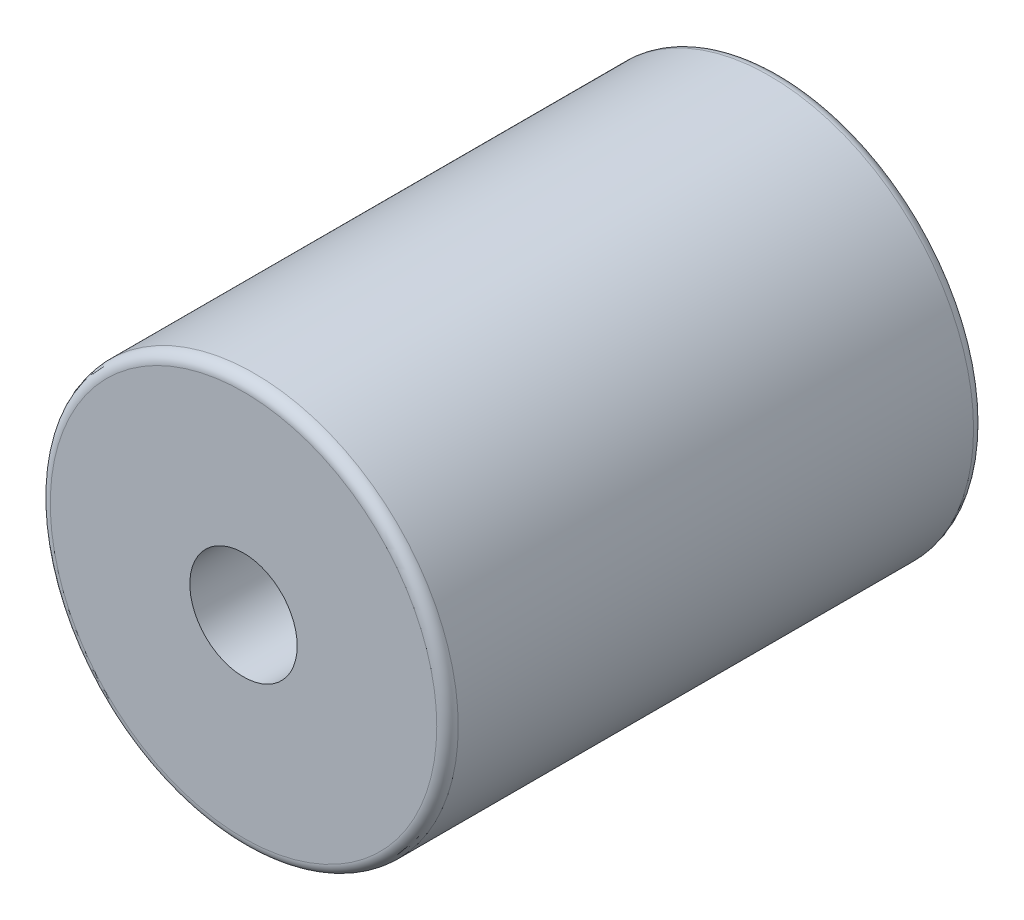
ISO-10303-21;
HEADER;
FILE_DESCRIPTION(('STEP AP214'),'2;1');
FILE_NAME('part.step','',(''),(''),'','','');
FILE_SCHEMA(('AUTOMOTIVE_DESIGN { 1 0 10303 214 1 1 1 1 }'));
ENDSEC;
DATA;
#1=APPLICATION_CONTEXT('core data for automotive mechanical design processes');
#2=APPLICATION_PROTOCOL_DEFINITION('international standard','automotive_design',2000,#1);
#3=PRODUCT_CONTEXT('',#1,'mechanical');
#4=PRODUCT('Part','Part','',(#3));
#5=PRODUCT_RELATED_PRODUCT_CATEGORY('part','',(#4));
#6=PRODUCT_DEFINITION_FORMATION('','',#4);
#7=PRODUCT_DEFINITION_CONTEXT('part definition',#1,'design');
#8=PRODUCT_DEFINITION('design','',#6,#7);
#9=PRODUCT_DEFINITION_SHAPE('','',#8);
#10=(LENGTH_UNIT() NAMED_UNIT(*) SI_UNIT(.MILLI.,.METRE.));
#11=(NAMED_UNIT(*) PLANE_ANGLE_UNIT() SI_UNIT($,.RADIAN.));
#12=(NAMED_UNIT(*) SI_UNIT($,.STERADIAN.) SOLID_ANGLE_UNIT());
#13=UNCERTAINTY_MEASURE_WITH_UNIT(LENGTH_MEASURE(1.E-05),#10,'distance_accuracy_value','');
#14=(GEOMETRIC_REPRESENTATION_CONTEXT(3) GLOBAL_UNCERTAINTY_ASSIGNED_CONTEXT((#13)) GLOBAL_UNIT_ASSIGNED_CONTEXT((#10,
#11,#12)) REPRESENTATION_CONTEXT('',''));
#15=CARTESIAN_POINT('',(0.,0.,0.));
#16=DIRECTION('',(0.,0.,1.));
#17=DIRECTION('',(1.,0.,0.));
#18=AXIS2_PLACEMENT_3D('',#15,#16,#17);
#19=CARTESIAN_POINT('',(0.,0.,4.5));
#20=DIRECTION('',(0.,0.,1.));
#21=DIRECTION('',(1.,0.,0.));
#22=AXIS2_PLACEMENT_3D('',#19,#20,#21);
#23=CYLINDRICAL_SURFACE('',#22,2.5);
#24=CARTESIAN_POINT('',(0.,0.,12.5));
#25=DIRECTION('',(0.,0.,1.));
#26=DIRECTION('',(1.,0.,0.));
#27=AXIS2_PLACEMENT_3D('',#24,#25,#26);
#28=CIRCLE('',#27,2.5);
#29=CARTESIAN_POINT('',(2.5,0.,12.5));
#30=VERTEX_POINT('',#29);
#31=EDGE_CURVE('E53',#30,#30,#28,.T.);
#32=ORIENTED_EDGE('',*,*,#31,.T.);
#33=EDGE_LOOP('',(#32));
#34=FACE_BOUND('',#33,.T.);
#35=CARTESIAN_POINT('',(0.,0.,5.5));
#36=DIRECTION('',(0.,0.,-1.));
#37=DIRECTION('',(-1.,0.,0.));
#38=AXIS2_PLACEMENT_3D('',#35,#36,#37);
#39=CIRCLE('',#38,2.5);
#40=CARTESIAN_POINT('',(-2.5,0.,5.5));
#41=VERTEX_POINT('',#40);
#42=EDGE_CURVE('E54',#41,#41,#39,.F.);
#43=ORIENTED_EDGE('',*,*,#42,.F.);
#44=EDGE_LOOP('',(#43));
#45=FACE_BOUND('',#44,.T.);
#46=ADVANCED_FACE('F33',(#34,#45),#23,.F.);
#47=CARTESIAN_POINT('',(0.,0.,-12.5));
#48=DIRECTION('',(0.,0.,1.));
#49=DIRECTION('',(1.,0.,0.));
#50=AXIS2_PLACEMENT_3D('',#47,#48,#49);
#51=CYLINDRICAL_SURFACE('',#50,9.5);
#52=CARTESIAN_POINT('',(0.,0.,12.));
#53=DIRECTION('',(0.,0.,1.));
#54=DIRECTION('',(1.,0.,0.));
#55=AXIS2_PLACEMENT_3D('',#52,#53,#54);
#56=CIRCLE('',#55,9.5);
#57=CARTESIAN_POINT('',(9.5,0.,12.));
#58=VERTEX_POINT('',#57);
#59=EDGE_CURVE('E10',#58,#58,#56,.F.);
#60=ORIENTED_EDGE('',*,*,#59,.T.);
#61=EDGE_LOOP('',(#60));
#62=FACE_BOUND('',#61,.T.);
#63=CARTESIAN_POINT('',(0.,0.,-12.));
#64=DIRECTION('',(0.,0.,1.));
#65=DIRECTION('',(1.,0.,0.));
#66=AXIS2_PLACEMENT_3D('',#63,#64,#65);
#67=CIRCLE('',#66,9.5);
#68=CARTESIAN_POINT('',(9.5,0.,-12.));
#69=VERTEX_POINT('',#68);
#70=EDGE_CURVE('E48',#69,#69,#67,.T.);
#71=ORIENTED_EDGE('',*,*,#70,.T.);
#72=EDGE_LOOP('',(#71));
#73=FACE_BOUND('',#72,.T.);
#74=ADVANCED_FACE('F79',(#62,#73),#51,.T.);
#75=CARTESIAN_POINT('',(0.,0.,-12.5));
#76=DIRECTION('',(0.,0.,1.));
#77=DIRECTION('',(1.,0.,0.));
#78=AXIS2_PLACEMENT_3D('',#75,#76,#77);
#79=PLANE('',#78);
#80=CARTESIAN_POINT('',(0.,0.,-12.5));
#81=DIRECTION('',(0.,0.,1.));
#82=DIRECTION('',(1.,0.,0.));
#83=AXIS2_PLACEMENT_3D('',#80,#81,#82);
#84=CIRCLE('',#83,9.);
#85=CARTESIAN_POINT('',(9.,0.,-12.5));
#86=VERTEX_POINT('',#85);
#87=EDGE_CURVE('E44',#86,#86,#84,.F.);
#88=ORIENTED_EDGE('',*,*,#87,.T.);
#89=EDGE_LOOP('',(#88));
#90=FACE_BOUND('',#89,.T.);
#91=CARTESIAN_POINT('',(0.,0.,-12.5));
#92=DIRECTION('',(0.,0.,-1.));
#93=DIRECTION('',(-1.,0.,0.));
#94=AXIS2_PLACEMENT_3D('',#91,#92,#93);
#95=CIRCLE('',#94,4.);
#96=CARTESIAN_POINT('',(-4.,0.,-12.5));
#97=VERTEX_POINT('',#96);
#98=EDGE_CURVE('E60',#97,#97,#95,.T.);
#99=ORIENTED_EDGE('',*,*,#98,.F.);
#100=EDGE_LOOP('',(#99));
#101=FACE_BOUND('',#100,.T.);
#102=ADVANCED_FACE('F76',(#90,#101),#79,.F.);
#103=CARTESIAN_POINT('',(0.,0.,12.5));
#104=DIRECTION('',(0.,0.,1.));
#105=DIRECTION('',(1.,0.,0.));
#106=AXIS2_PLACEMENT_3D('',#103,#104,#105);
#107=PLANE('',#106);
#108=CARTESIAN_POINT('',(0.,0.,12.5));
#109=DIRECTION('',(0.,0.,1.));
#110=DIRECTION('',(1.,0.,0.));
#111=AXIS2_PLACEMENT_3D('',#108,#109,#110);
#112=CIRCLE('',#111,9.);
#113=CARTESIAN_POINT('',(9.,0.,12.5));
#114=VERTEX_POINT('',#113);
#115=EDGE_CURVE('E40',#114,#114,#112,.T.);
#116=ORIENTED_EDGE('',*,*,#115,.T.);
#117=EDGE_LOOP('',(#116));
#118=FACE_BOUND('',#117,.T.);
#119=ORIENTED_EDGE('',*,*,#31,.F.);
#120=EDGE_LOOP('',(#119));
#121=FACE_BOUND('',#120,.T.);
#122=ADVANCED_FACE('F78',(#118,#121),#107,.T.);
#123=CARTESIAN_POINT('',(0.,0.,5.5));
#124=DIRECTION('',(0.,0.,-1.));
#125=DIRECTION('',(-1.,0.,0.));
#126=AXIS2_PLACEMENT_3D('',#123,#124,#125);
#127=PLANE('',#126);
#128=CARTESIAN_POINT('',(0.,0.,5.5));
#129=DIRECTION('',(0.,0.,-1.));
#130=DIRECTION('',(-1.,0.,0.));
#131=AXIS2_PLACEMENT_3D('',#128,#129,#130);
#132=CIRCLE('',#131,4.);
#133=CARTESIAN_POINT('',(-4.,0.,5.5));
#134=VERTEX_POINT('',#133);
#135=EDGE_CURVE('E57',#134,#134,#132,.T.);
#136=ORIENTED_EDGE('',*,*,#135,.T.);
#137=EDGE_LOOP('',(#136));
#138=FACE_BOUND('',#137,.T.);
#139=ORIENTED_EDGE('',*,*,#42,.T.);
#140=EDGE_LOOP('',(#139));
#141=FACE_BOUND('',#140,.T.);
#142=ADVANCED_FACE('F66',(#138,#141),#127,.T.);
#143=CARTESIAN_POINT('',(0.,0.,5.5));
#144=DIRECTION('',(0.,0.,-1.));
#145=DIRECTION('',(-1.,0.,0.));
#146=AXIS2_PLACEMENT_3D('',#143,#144,#145);
#147=CYLINDRICAL_SURFACE('',#146,4.);
#148=ORIENTED_EDGE('',*,*,#135,.F.);
#149=EDGE_LOOP('',(#148));
#150=FACE_BOUND('',#149,.T.);
#151=ORIENTED_EDGE('',*,*,#98,.T.);
#152=EDGE_LOOP('',(#151));
#153=FACE_BOUND('',#152,.T.);
#154=ADVANCED_FACE('F69',(#150,#153),#147,.F.);
#155=CARTESIAN_POINT('',(0.,0.,-12.));
#156=DIRECTION('',(0.,0.,1.));
#157=DIRECTION('',(1.,0.,0.));
#158=AXIS2_PLACEMENT_3D('',#155,#156,#157);
#159=TOROIDAL_SURFACE('',#158,9.,0.5);
#160=ORIENTED_EDGE('',*,*,#87,.F.);
#161=EDGE_LOOP('',(#160));
#162=FACE_BOUND('',#161,.T.);
#163=ORIENTED_EDGE('',*,*,#70,.F.);
#164=EDGE_LOOP('',(#163));
#165=FACE_BOUND('',#164,.T.);
#166=ADVANCED_FACE('F72',(#162,#165),#159,.T.);
#167=CARTESIAN_POINT('',(0.,0.,12.));
#168=DIRECTION('',(0.,0.,1.));
#169=DIRECTION('',(1.,0.,0.));
#170=AXIS2_PLACEMENT_3D('',#167,#168,#169);
#171=TOROIDAL_SURFACE('',#170,9.,0.5);
#172=ORIENTED_EDGE('',*,*,#59,.F.);
#173=EDGE_LOOP('',(#172));
#174=FACE_BOUND('',#173,.T.);
#175=ORIENTED_EDGE('',*,*,#115,.F.);
#176=EDGE_LOOP('',(#175));
#177=FACE_BOUND('',#176,.T.);
#178=ADVANCED_FACE('F35',(#174,#177),#171,.T.);
#179=CLOSED_SHELL('',(#46,#74,#102,#122,#142,#154,#166,#178));
#180=MANIFOLD_SOLID_BREP('B2',#179);
#181=ADVANCED_BREP_SHAPE_REPRESENTATION('',(#18,#180),#14);
#182=SHAPE_DEFINITION_REPRESENTATION(#9,#181);
ENDSEC;
END-ISO-10303-21;
